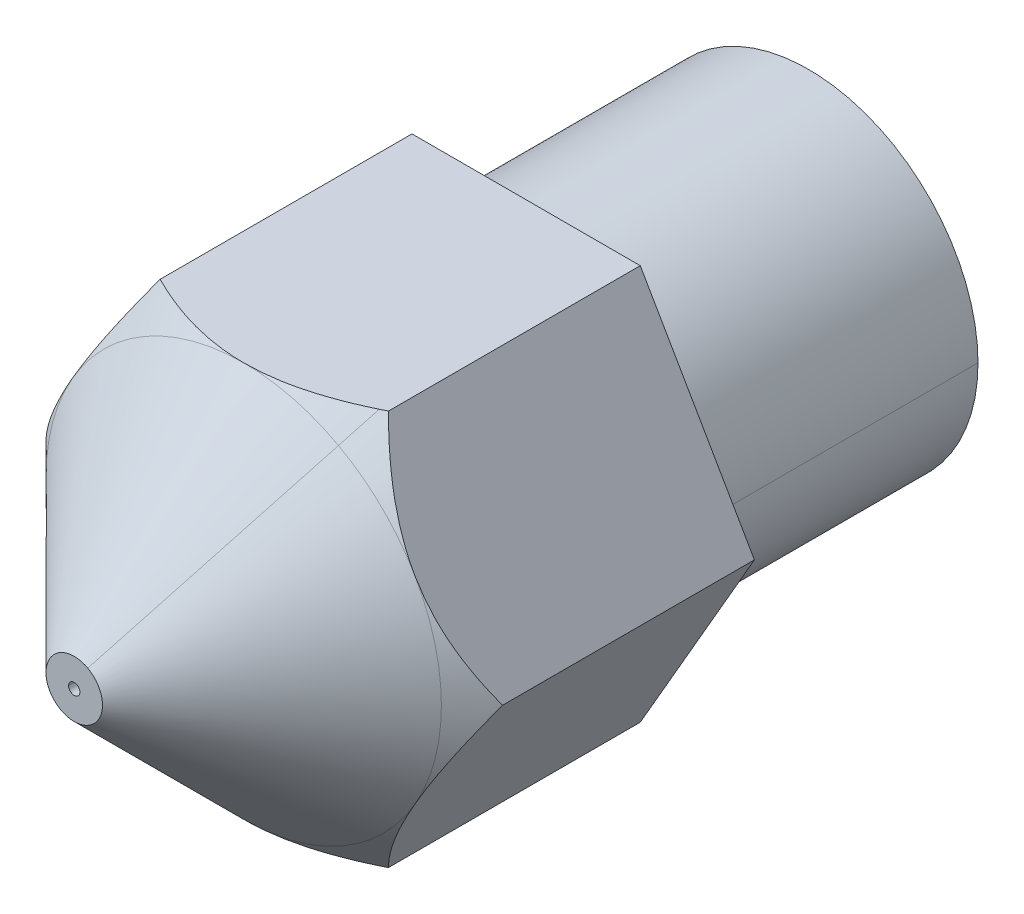
ISO-10303-21;
HEADER;
FILE_DESCRIPTION(('STEP AP214'),'2;1');
FILE_NAME('part.step','',(''),(''),'','','');
FILE_SCHEMA(('AUTOMOTIVE_DESIGN { 1 0 10303 214 1 1 1 1 }'));
ENDSEC;
DATA;
#1=APPLICATION_CONTEXT('core data for automotive mechanical design processes');
#2=APPLICATION_PROTOCOL_DEFINITION('international standard','automotive_design',2000,#1);
#3=PRODUCT_CONTEXT('',#1,'mechanical');
#4=PRODUCT('Part','Part','',(#3));
#5=PRODUCT_RELATED_PRODUCT_CATEGORY('part','',(#4));
#6=PRODUCT_DEFINITION_FORMATION('','',#4);
#7=PRODUCT_DEFINITION_CONTEXT('part definition',#1,'design');
#8=PRODUCT_DEFINITION('design','',#6,#7);
#9=PRODUCT_DEFINITION_SHAPE('','',#8);
#10=(LENGTH_UNIT() NAMED_UNIT(*) SI_UNIT(.MILLI.,.METRE.));
#11=(NAMED_UNIT(*) PLANE_ANGLE_UNIT() SI_UNIT($,.RADIAN.));
#12=(NAMED_UNIT(*) SI_UNIT($,.STERADIAN.) SOLID_ANGLE_UNIT());
#13=UNCERTAINTY_MEASURE_WITH_UNIT(LENGTH_MEASURE(1.E-05),#10,'distance_accuracy_value','');
#14=(GEOMETRIC_REPRESENTATION_CONTEXT(3) GLOBAL_UNCERTAINTY_ASSIGNED_CONTEXT((#13)) GLOBAL_UNIT_ASSIGNED_CONTEXT((#10,
#11,#12)) REPRESENTATION_CONTEXT('',''));
#15=CARTESIAN_POINT('',(0.,0.,0.));
#16=DIRECTION('',(0.,0.,1.));
#17=DIRECTION('',(1.,0.,0.));
#18=AXIS2_PLACEMENT_3D('',#15,#16,#17);
#19=CARTESIAN_POINT('',(0.,0.,8.));
#20=DIRECTION('',(0.,0.,1.));
#21=DIRECTION('',(1.,0.,0.));
#22=AXIS2_PLACEMENT_3D('',#19,#20,#21);
#23=PLANE('',#22);
#24=CARTESIAN_POINT('',(0.,0.,8.));
#25=DIRECTION('',(0.,0.,1.));
#26=DIRECTION('',(1.,0.,0.));
#27=AXIS2_PLACEMENT_3D('',#24,#25,#26);
#28=CIRCLE('',#27,0.1);
#29=CARTESIAN_POINT('',(-0.1,0.,8.));
#30=VERTEX_POINT('',#29);
#31=CARTESIAN_POINT('',(0.1,0.,8.));
#32=VERTEX_POINT('',#31);
#33=EDGE_CURVE('E272',#30,#32,#28,.F.);
#34=ORIENTED_EDGE('',*,*,#33,.T.);
#35=CARTESIAN_POINT('',(0.,0.,8.));
#36=DIRECTION('',(0.,0.,1.));
#37=DIRECTION('',(1.,0.,0.));
#38=AXIS2_PLACEMENT_3D('',#35,#36,#37);
#39=CIRCLE('',#38,0.1);
#40=EDGE_CURVE('E874',#32,#30,#39,.F.);
#41=ORIENTED_EDGE('',*,*,#40,.T.);
#42=EDGE_LOOP('',(#34,#41));
#43=FACE_BOUND('',#42,.T.);
#44=CARTESIAN_POINT('',(0.,0.,7.99999999998136));
#45=DIRECTION('',(0.,0.,-1.));
#46=DIRECTION('',(-1.,0.,0.));
#47=AXIS2_PLACEMENT_3D('',#44,#45,#46);
#48=CIRCLE('',#47,0.500000000009776);
#49=CARTESIAN_POINT('',(-0.239712769300711,-0.43879128094552,7.99999999998136));
#50=VERTEX_POINT('',#49);
#51=CARTESIAN_POINT('',(0.239712769306789,0.438791280953767,7.99999999998136));
#52=VERTEX_POINT('',#51);
#53=EDGE_CURVE('E19',#50,#52,#48,.T.);
#54=ORIENTED_EDGE('',*,*,#53,.F.);
#55=CARTESIAN_POINT('',(0.,0.,7.99999999998136));
#56=DIRECTION('',(0.,0.,-1.));
#57=DIRECTION('',(-1.,0.,0.));
#58=AXIS2_PLACEMENT_3D('',#55,#56,#57);
#59=CIRCLE('',#58,0.500000000009776);
#60=EDGE_CURVE('E116',#52,#50,#59,.T.);
#61=ORIENTED_EDGE('',*,*,#60,.F.);
#62=EDGE_LOOP('',(#54,#61));
#63=FACE_BOUND('',#62,.T.);
#64=ADVANCED_FACE('F16',(#43,#63),#23,.T.);
#65=CARTESIAN_POINT('',(0.,0.,4.99999999988177));
#66=DIRECTION('',(0.,0.,-1.));
#67=DIRECTION('',(-1.,0.,0.));
#68=AXIS2_PLACEMENT_3D('',#65,#66,#67);
#69=CONICAL_SURFACE('',#68,3.50000000010789,0.785398163397202);
#70=ORIENTED_EDGE('',*,*,#53,.T.);
#71=CARTESIAN_POINT('',(1.67798938512427,3.07153896664613,4.99999999999545));
#72=CARTESIAN_POINT('',(1.61806119280186,2.96184114639585,5.12499999997491));
#73=CARTESIAN_POINT('',(1.55813300047966,2.85214332615662,5.24999999996417));
#74=CARTESIAN_POINT('',(1.43827661583465,2.63274768567851,5.49999999996163));
#75=CARTESIAN_POINT('',(1.37834842351184,2.52304986543962,5.62499999996984));
#76=CARTESIAN_POINT('',(1.25849203887364,2.30365422495704,5.8749999999856));
#77=CARTESIAN_POINT('',(1.19856384655825,2.19395640471335,5.99999999999315));
#78=CARTESIAN_POINT('',(1.07870746189761,1.97456076425215,6.24999999998587));
#79=CARTESIAN_POINT('',(1.01877926955236,1.86486294403462,6.37499999997104));
#80=CARTESIAN_POINT('',(0.898922884891036,1.64546730357457,6.62499999996445));
#81=CARTESIAN_POINT('',(0.838994692574969,1.53576948333204,6.74999999997269));
#82=CARTESIAN_POINT('',(0.719138307931427,1.31637384285002,6.99999999998638));
#83=CARTESIAN_POINT('',(0.659210115603953,1.20667602261054,7.12499999999183));
#84=CARTESIAN_POINT('',(0.53935373095432,0.987280382132798,7.37500000000635));
#85=CARTESIAN_POINT('',(0.479425538632161,0.87758256189455,7.50000000001544));
#86=CARTESIAN_POINT('',(0.359569153977755,0.658186921418388,7.75000000001465));
#87=CARTESIAN_POINT('',(0.299640961645507,0.548489101180475,7.87500000000478));
#88=CARTESIAN_POINT('',(0.23971276929706,0.438791280935958,7.99999999998136));
#89=B_SPLINE_CURVE_WITH_KNOTS('',3,(#71,#72,#73,#74,#75,#76,#77,#78,#79,#80,#81,#82,#83,#84,#85,
#86,#87,#88),.UNSPECIFIED.,.F.,.F.,(4,2,2,2,2,2,2,2,4),(0.,0.530330085869191,1.06066017177858,
1.59099025768796,2.12132034353152,2.6516504294409,3.18198051535029,3.71231060125967,
4.2426406871385),.UNSPECIFIED.);
#90=CARTESIAN_POINT('',(1.67798938507802,3.0715389665706,4.99999999999545));
#91=VERTEX_POINT('',#90);
#92=EDGE_CURVE('E109',#91,#52,#89,.T.);
#93=ORIENTED_EDGE('',*,*,#92,.F.);
#94=CARTESIAN_POINT('',(0.,0.,4.99999999993861));
#95=DIRECTION('',(0.,0.,-1.));
#96=DIRECTION('',(-0.479425538613767,-0.877582561885148,0.));
#97=AXIS2_PLACEMENT_3D('',#94,#95,#96);
#98=CIRCLE('',#97,3.49999999993098);
#99=CARTESIAN_POINT('',(0.,3.5,4.99999999997553));
#100=VERTEX_POINT('',#99);
#101=EDGE_CURVE('E404',#100,#91,#98,.T.);
#102=ORIENTED_EDGE('',*,*,#101,.F.);
#103=CARTESIAN_POINT('',(0.,0.,5.0000000000523));
#104=DIRECTION('',(0.,0.,-1.));
#105=DIRECTION('',(-0.479425538606934,-0.877582561888881,0.));
#106=AXIS2_PLACEMENT_3D('',#103,#104,#105);
#107=CIRCLE('',#106,3.49999999998087);
#108=CARTESIAN_POINT('',(-3.03108891323643,1.7499999999939,4.99999999999545));
#109=VERTEX_POINT('',#108);
#110=EDGE_CURVE('E387',#109,#100,#107,.T.);
#111=ORIENTED_EDGE('',*,*,#110,.F.);
#112=CARTESIAN_POINT('',(0.,0.,4.99999999993861));
#113=DIRECTION('',(0.,0.,-1.));
#114=DIRECTION('',(-0.479425538606934,-0.877582561888881,0.));
#115=AXIS2_PLACEMENT_3D('',#112,#113,#114);
#116=CIRCLE('',#115,3.49999999998087);
#117=CARTESIAN_POINT('',(-3.03108891323841,-1.74999999999504,4.99999999996703));
#118=VERTEX_POINT('',#117);
#119=EDGE_CURVE('E374',#118,#109,#116,.T.);
#120=ORIENTED_EDGE('',*,*,#119,.F.);
#121=CARTESIAN_POINT('',(0.,0.,4.99999999999545));
#122=DIRECTION('',(0.,0.,-1.));
#123=DIRECTION('',(-0.47942553860068,-0.877582561892297,0.));
#124=AXIS2_PLACEMENT_3D('',#121,#122,#123);
#125=CIRCLE('',#124,3.49999999996724);
#126=CARTESIAN_POINT('',(-1.67798938510799,-3.07153896659429,4.99999999996703));
#127=VERTEX_POINT('',#126);
#128=EDGE_CURVE('E388',#127,#118,#125,.T.);
#129=ORIENTED_EDGE('',*,*,#128,.F.);
#130=DIRECTION('',(0.339005049420893,0.620544580563467,0.707106781186864));
#131=VECTOR('',#130,1.);
#132=CARTESIAN_POINT('',(-239237.418880361,-437921.157834679,-499000.));
#133=LINE('',#132,#131);
#134=EDGE_CURVE('E113',#50,#127,#133,.F.);
#135=ORIENTED_EDGE('',*,*,#134,.F.);
#136=EDGE_LOOP('',(#70,#93,#102,#111,#120,#129,#135));
#137=FACE_BOUND('',#136,.T.);
#138=ADVANCED_FACE('F106',(#137),#69,.T.);
#139=CARTESIAN_POINT('',(0.,0.,4.99999999988177));
#140=DIRECTION('',(0.,0.,-1.));
#141=DIRECTION('',(-1.,0.,0.));
#142=AXIS2_PLACEMENT_3D('',#139,#140,#141);
#143=CONICAL_SURFACE('',#142,3.50000000010789,0.785398163397202);
#144=ORIENTED_EDGE('',*,*,#60,.T.);
#145=ORIENTED_EDGE('',*,*,#134,.T.);
#146=CARTESIAN_POINT('',(0.,0.,4.99999999993861));
#147=DIRECTION('',(0.,0.,-1.));
#148=DIRECTION('',(-0.479425538613767,-0.877582561885148,0.));
#149=AXIS2_PLACEMENT_3D('',#146,#147,#148);
#150=CIRCLE('',#149,3.49999999993098);
#151=CARTESIAN_POINT('',(0.,-3.5,4.99999999997553));
#152=VERTEX_POINT('',#151);
#153=EDGE_CURVE('E369',#152,#127,#150,.T.);
#154=ORIENTED_EDGE('',*,*,#153,.F.);
#155=CARTESIAN_POINT('',(0.,0.,5.0000000000523));
#156=DIRECTION('',(0.,0.,-1.));
#157=DIRECTION('',(-0.479425538606934,-0.877582561888881,0.));
#158=AXIS2_PLACEMENT_3D('',#155,#156,#157);
#159=CIRCLE('',#158,3.49999999998087);
#160=CARTESIAN_POINT('',(3.03108891323643,-1.74999999999389,4.99999999999545));
#161=VERTEX_POINT('',#160);
#162=EDGE_CURVE('E392',#161,#152,#159,.T.);
#163=ORIENTED_EDGE('',*,*,#162,.F.);
#164=CARTESIAN_POINT('',(0.,0.,4.99999999993861));
#165=DIRECTION('',(0.,0.,-1.));
#166=DIRECTION('',(-0.479425538606934,-0.877582561888881,0.));
#167=AXIS2_PLACEMENT_3D('',#164,#165,#166);
#168=CIRCLE('',#167,3.49999999998087);
#169=CARTESIAN_POINT('',(3.03108891323841,1.74999999999504,4.99999999996703));
#170=VERTEX_POINT('',#169);
#171=EDGE_CURVE('E435',#170,#161,#168,.T.);
#172=ORIENTED_EDGE('',*,*,#171,.F.);
#173=CARTESIAN_POINT('',(0.,0.,4.99999999999545));
#174=DIRECTION('',(0.,0.,-1.));
#175=DIRECTION('',(-0.47942553860068,-0.877582561892297,0.));
#176=AXIS2_PLACEMENT_3D('',#173,#174,#175);
#177=CIRCLE('',#176,3.49999999996724);
#178=EDGE_CURVE('E122',#91,#170,#177,.T.);
#179=ORIENTED_EDGE('',*,*,#178,.F.);
#180=ORIENTED_EDGE('',*,*,#92,.T.);
#181=EDGE_LOOP('',(#144,#145,#154,#163,#172,#179,#180));
#182=FACE_BOUND('',#181,.T.);
#183=ADVANCED_FACE('F120',(#182),#143,.T.);
#184=CARTESIAN_POINT('',(0.,0.,1.));
#185=DIRECTION('',(0.,0.,1.));
#186=DIRECTION('',(1.,0.,0.));
#187=AXIS2_PLACEMENT_3D('',#184,#185,#186);
#188=CYLINDRICAL_SURFACE('',#187,0.1);
#189=DIRECTION('',(0.,0.,1.));
#190=VECTOR('',#189,1.);
#191=CARTESIAN_POINT('',(-0.1,0.,1.));
#192=LINE('',#191,#190);
#193=CARTESIAN_POINT('',(-0.1,0.,1.99999999998817));
#194=VERTEX_POINT('',#193);
#195=EDGE_CURVE('E428',#194,#30,#192,.T.);
#196=ORIENTED_EDGE('',*,*,#195,.T.);
#197=ORIENTED_EDGE('',*,*,#40,.F.);
#198=DIRECTION('',(0.,0.,1.));
#199=VECTOR('',#198,1.);
#200=CARTESIAN_POINT('',(0.1,0.,1.));
#201=LINE('',#200,#199);
#202=CARTESIAN_POINT('',(0.100000000007935,0.,1.99999999998817));
#203=VERTEX_POINT('',#202);
#204=EDGE_CURVE('E411',#32,#203,#201,.F.);
#205=ORIENTED_EDGE('',*,*,#204,.T.);
#206=CARTESIAN_POINT('',(0.,0.,1.99999999995271));
#207=DIRECTION('',(0.,0.,-1.));
#208=DIRECTION('',(1.,0.,0.));
#209=AXIS2_PLACEMENT_3D('',#206,#207,#208);
#210=CIRCLE('',#209,0.100000000031741);
#211=EDGE_CURVE('E433',#203,#194,#210,.T.);
#212=ORIENTED_EDGE('',*,*,#211,.T.);
#213=EDGE_LOOP('',(#196,#197,#205,#212));
#214=FACE_BOUND('',#213,.T.);
#215=ADVANCED_FACE('F146',(#214),#188,.F.);
#216=CARTESIAN_POINT('',(0.,0.,1.));
#217=DIRECTION('',(0.,0.,1.));
#218=DIRECTION('',(1.,0.,0.));
#219=AXIS2_PLACEMENT_3D('',#216,#217,#218);
#220=CYLINDRICAL_SURFACE('',#219,0.1);
#221=ORIENTED_EDGE('',*,*,#204,.F.);
#222=ORIENTED_EDGE('',*,*,#33,.F.);
#223=ORIENTED_EDGE('',*,*,#195,.F.);
#224=CARTESIAN_POINT('',(0.,0.,1.99999999995271));
#225=DIRECTION('',(0.,0.,-1.));
#226=DIRECTION('',(1.,0.,0.));
#227=AXIS2_PLACEMENT_3D('',#224,#225,#226);
#228=CIRCLE('',#227,0.100000000031741);
#229=EDGE_CURVE('E271',#194,#203,#228,.T.);
#230=ORIENTED_EDGE('',*,*,#229,.T.);
#231=EDGE_LOOP('',(#221,#222,#223,#230));
#232=FACE_BOUND('',#231,.T.);
#233=ADVANCED_FACE('F779',(#232),#220,.F.);
#234=CARTESIAN_POINT('',(0.,0.,4.50884186636813));
#235=DIRECTION('',(0.,0.,-1.));
#236=DIRECTION('',(-1.,0.,0.));
#237=AXIS2_PLACEMENT_3D('',#234,#235,#236);
#238=CONICAL_SURFACE('',#237,3.99115813356201,0.785398163429384);
#239=DIRECTION('',(-0.339005049422463,-0.62054458056261,0.707106781186865));
#240=VECTOR('',#239,1.);
#241=CARTESIAN_POINT('',(239237.418881469,437921.157834074,-499000.));
#242=LINE('',#241,#240);
#243=CARTESIAN_POINT('',(1.91205871442823,3.49999999998704,4.51177125429312));
#244=VERTEX_POINT('',#243);
#245=EDGE_CURVE('E405',#244,#91,#242,.T.);
#246=ORIENTED_EDGE('',*,*,#245,.F.);
#247=CARTESIAN_POINT('',(0.,3.50000000001517,4.99999999990506));
#248=CARTESIAN_POINT('',(0.0537438893080083,3.50000000000559,5.00000431740818));
#249=CARTESIAN_POINT('',(0.107479833417426,3.50000000000153,4.99876149660475));
#250=CARTESIAN_POINT('',(0.214830405244049,3.49999999999847,4.99382215420302));
#251=CARTESIAN_POINT('',(0.268445051156603,3.49999999999947,4.99012602901145));
#252=CARTESIAN_POINT('',(0.428769144089407,3.50000000000107,4.97543679133601));
#253=CARTESIAN_POINT('',(0.535166225951488,3.50000000000028,4.96084250495271));
#254=CARTESIAN_POINT('',(0.744779456656462,3.49999999999972,4.92310106009015));
#255=CARTESIAN_POINT('',(0.848019372597776,3.49999999999992,4.90008257601016));
#256=CARTESIAN_POINT('',(1.05252816620887,3.50000000000008,4.84649885454744));
#257=CARTESIAN_POINT('',(1.15379650469752,3.50000000000002,4.81593158317247));
#258=CARTESIAN_POINT('',(1.36592879184903,3.49999999999998,4.74438489932662));
#259=CARTESIAN_POINT('',(1.47652073776792,3.5,4.70260377302413));
#260=CARTESIAN_POINT('',(1.64079899803225,3.5,4.63480851587852));
#261=CARTESIAN_POINT('',(1.69551871253213,3.5,4.61124519519848));
#262=CARTESIAN_POINT('',(1.80428632574313,3.5,4.56260407099588));
#263=CARTESIAN_POINT('',(1.85833417612897,3.5,4.53752615928442));
#264=CARTESIAN_POINT('',(1.91205871440441,3.5,4.51177125431746));
#265=B_SPLINE_CURVE_WITH_KNOTS('',3,(#247,#248,#249,#250,#251,#252,#253,#254,#255,#256,#257,
#258,#259,#260,#261,#262,#263,#264),.UNSPECIFIED.,.F.,.F.,(4,2,2,2,2,2,2,2,4),(0.,
0.161202115360536,0.322378189903186,0.644110241448437,0.961120228910556,1.2782157268909,
1.63260008767214,1.81131453852701,1.99004177028349),.UNSPECIFIED.);
#266=EDGE_CURVE('E237',#100,#244,#265,.T.);
#267=ORIENTED_EDGE('',*,*,#266,.F.);
#268=ORIENTED_EDGE('',*,*,#101,.T.);
#269=EDGE_LOOP('',(#246,#267,#268));
#270=FACE_BOUND('',#269,.T.);
#271=ADVANCED_FACE('F278',(#270),#238,.T.);
#272=CARTESIAN_POINT('',(0.,0.,4.45529935950617));
#273=DIRECTION('',(0.,0.,-1.));
#274=DIRECTION('',(-1.,0.,0.));
#275=AXIS2_PLACEMENT_3D('',#272,#273,#274);
#276=CONICAL_SURFACE('',#275,4.04470064052161,0.785398163398872);
#277=CARTESIAN_POINT('',(-2.02072594217201,3.49999999999595,4.45854811569402));
#278=CARTESIAN_POINT('',(-1.88093245127298,3.49999999999854,4.52837901785558));
#279=CARTESIAN_POINT('',(-1.73877627195135,3.49999999999961,4.59408444819449));
#280=CARTESIAN_POINT('',(-1.44879621005957,3.50000000000039,4.71432170140717));
#281=CARTESIAN_POINT('',(-1.30094201392687,3.5000000000001,4.76877974906485));
#282=CARTESIAN_POINT('',(-1.00476955774459,3.4999999999999,4.86126198890604));
#283=CARTESIAN_POINT('',(-0.856589672504894,3.49999999999997,4.89971780199748));
#284=CARTESIAN_POINT('',(-0.557051165471067,3.50000000000003,4.95896722037616));
#285=CARTESIAN_POINT('',(-0.40570372153932,3.5,4.97981478233541));
#286=CARTESIAN_POINT('',(-0.211604713552417,3.5,4.99386421140873));
#287=CARTESIAN_POINT('',(-0.169418902062033,3.5,4.9961570401718));
#288=CARTESIAN_POINT('',(-0.0848248871663844,3.5,4.9992273432721));
#289=CARTESIAN_POINT('',(-0.0424164647431157,3.5,4.99999877930066));
#290=CARTESIAN_POINT('',(0.,3.5,5.00000000002624));
#291=B_SPLINE_CURVE_WITH_KNOTS('',3,(#277,#278,#279,#280,#281,#282,#283,#284,#285,#286,#287,
#288,#289,#290),.UNSPECIFIED.,.F.,.F.,(4,2,2,2,2,2,4),(0.,0.469138863521484,0.941263532851166,
1.39966676498238,1.85666017024131,1.98338469941467,2.11061118580354),.UNSPECIFIED.);
#292=CARTESIAN_POINT('',(-2.02072594216645,3.5,4.45854811569902));
#293=VERTEX_POINT('',#292);
#294=EDGE_CURVE('E262',#293,#100,#291,.T.);
#295=ORIENTED_EDGE('',*,*,#294,.F.);
#296=CARTESIAN_POINT('',(-3.03108891324427,1.74999999999669,5.00000000002899));
#297=CARTESIAN_POINT('',(-3.00421079533778,1.79655426582253,5.00000430482122));
#298=CARTESIAN_POINT('',(-2.97733669567062,1.8431015718537,4.99876092167403));
#299=CARTESIAN_POINT('',(-2.92364907977518,1.93609125032179,4.99381933160931));
#300=CARTESIAN_POINT('',(-2.89683555468245,1.98253363811239,4.99012151084873));
#301=CARTESIAN_POINT('',(-2.81665771078186,2.12140573738948,4.97542599034025));
#302=CARTESIAN_POINT('',(-2.76344953244113,2.21356500565377,4.96082591165504));
#303=CARTESIAN_POINT('',(-2.65864660022774,2.39508900902946,4.92307849947422));
#304=CARTESIAN_POINT('',(-2.60703961577896,2.48447492812012,4.90006339492437));
#305=CARTESIAN_POINT('',(-2.504804852753,2.66155073198076,4.84648680811154));
#306=CARTESIAN_POINT('',(-2.45417738621706,2.74924007627945,4.81592296240941));
#307=CARTESIAN_POINT('',(-2.37137915304133,2.89265082291667,4.76007104486398));
#308=CARTESIAN_POINT('',(-2.33889170638276,2.94892073113749,4.73662459523922));
#309=CARTESIAN_POINT('',(-2.27439263499997,3.06063639981342,4.68728344897216));
#310=CARTESIAN_POINT('',(-2.24238091155688,3.11608233125468,4.66138926871358));
#311=CARTESIAN_POINT('',(-2.17849278970334,3.2267398043051,4.60714796474922));
#312=CARTESIAN_POINT('',(-2.14662121328686,3.28194299397573,4.57877824566594));
#313=CARTESIAN_POINT('',(-2.08333556508252,3.39155695205553,4.52007399763608));
#314=CARTESIAN_POINT('',(-2.0519214629953,3.44596777294472,4.48973959954537));
#315=CARTESIAN_POINT('',(-2.02072594215368,3.50000000001095,4.45854811569592));
#316=B_SPLINE_CURVE_WITH_KNOTS('',3,(#296,#297,#298,#299,#300,#301,#302,#303,#304,#305,#306,
#307,#308,#309,#310,#311,#312,#313,#314,#315),.UNSPECIFIED.,.F.,.F.,(4,2,2,2,2,2,2,2,2,4),(0.,
0.161238963224039,0.32245256471502,0.644242625579463,0.961179512596089,1.27821575561131,
1.48539667251879,1.69253397878685,1.90181313169413,2.11107836003676),.UNSPECIFIED.);
#317=EDGE_CURVE('E284',#109,#293,#316,.T.);
#318=ORIENTED_EDGE('',*,*,#317,.F.);
#319=ORIENTED_EDGE('',*,*,#110,.T.);
#320=EDGE_LOOP('',(#295,#318,#319));
#321=FACE_BOUND('',#320,.T.);
#322=ADVANCED_FACE('F274',(#321),#276,.T.);
#323=CARTESIAN_POINT('',(0.,0.,4.45529935939248));
#324=DIRECTION('',(0.,0.,-1.));
#325=DIRECTION('',(-1.,0.,0.));
#326=AXIS2_PLACEMENT_3D('',#323,#324,#325);
#327=CONICAL_SURFACE('',#326,4.04470064053524,0.785398163347004);
#328=CARTESIAN_POINT('',(-4.04145188432244,2.47660141388499E-11,4.45854811562034));
#329=CARTESIAN_POINT('',(-3.9715551388731,0.121064714413331,4.52837901777724));
#330=CARTESIAN_POINT('',(-3.90047704921647,0.244175576998003,4.59408444811443));
#331=CARTESIAN_POINT('',(-3.75548701828248,0.495305677162509,4.71432170132728));
#332=CARTESIAN_POINT('',(-3.68155992022385,0.623351167057593,4.76877974898687));
#333=CARTESIAN_POINT('',(-3.53347369214704,0.879844037988781,4.86126198883297));
#334=CARTESIAN_POINT('',(-3.45938374953383,1.00817158292429,4.8997178019274));
#335=CARTESIAN_POINT('',(-3.30961449603023,1.26757953940378,4.95896722031412));
#336=CARTESIAN_POINT('',(-3.23394077407104,1.39865027063499,4.97981478227842));
#337=CARTESIAN_POINT('',(-3.13689127007353,1.56674494240797,4.99386421136096));
#338=CARTESIAN_POINT('',(-3.11579836431781,1.60327892685611,4.9961570401266));
#339=CARTESIAN_POINT('',(-3.0735013568488,1.67653949280053,4.99922734323037));
#340=CARTESIAN_POINT('',(-3.05229714562649,1.71326626397196,4.99999877925982));
#341=CARTESIAN_POINT('',(-3.03108891324427,1.74999999999669,4.99999999998543));
#342=B_SPLINE_CURVE_WITH_KNOTS('',3,(#328,#329,#330,#331,#332,#333,#334,#335,#336,#337,#338,
#339,#340,#341),.UNSPECIFIED.,.F.,.F.,(4,2,2,2,2,2,4),(0.,0.46913886348355,0.941263532775377,
1.39966676486923,1.85666017009083,1.98338469932758,2.11061118578039),.UNSPECIFIED.);
#343=CARTESIAN_POINT('',(-4.04145188432114,1.07700006891157E-11,4.45854811560691));
#344=VERTEX_POINT('',#343);
#345=EDGE_CURVE('E238',#344,#109,#342,.T.);
#346=ORIENTED_EDGE('',*,*,#345,.F.);
#347=CARTESIAN_POINT('',(-3.03108891324823,-1.74999999999898,4.99999999998085));
#348=CARTESIAN_POINT('',(-3.05796703115233,-1.70344573417729,5.00000430477299));
#349=CARTESIAN_POINT('',(-3.08484113081709,-1.65689842815026,4.9987609216258));
#350=CARTESIAN_POINT('',(-3.13852874670775,-1.56390874969046,4.99381933156128));
#351=CARTESIAN_POINT('',(-3.16534227179808,-1.517466361904,4.99012151080089));
#352=CARTESIAN_POINT('',(-3.24552011569151,-1.37859426263932,4.97542599029324));
#353=CARTESIAN_POINT('',(-3.29872829402748,-1.28643499438328,4.96082591160895));
#354=CARTESIAN_POINT('',(-3.40353122623138,-1.10491099102402,4.92307849943059));
#355=CARTESIAN_POINT('',(-3.45513821067544,-1.01552507194153,4.9000633948823));
#356=CARTESIAN_POINT('',(-3.557372973692,-0.838449268097193,4.84648680807308));
#357=CARTESIAN_POINT('',(-3.60800044022325,-0.750759923806605,4.81592296237302));
#358=CARTESIAN_POINT('',(-3.69079867339736,-0.607349177172183,4.7600710448272));
#359=CARTESIAN_POINT('',(-3.72328612005891,-0.551079268946232,4.73662459519937));
#360=CARTESIAN_POINT('',(-3.78778519144747,-0.439363600260295,4.68728344892545));
#361=CARTESIAN_POINT('',(-3.81979691489337,-0.383917668814182,4.66138926866307));
#362=CARTESIAN_POINT('',(-3.88368503675247,-0.273260195754112,4.60714796469039));
#363=CARTESIAN_POINT('',(-3.91555661317172,-0.218057006078691,4.57877824560257));
#364=CARTESIAN_POINT('',(-3.97884226138143,-0.108443047989608,4.52007399756313));
#365=CARTESIAN_POINT('',(-4.01025636347124,-0.054032227095914,4.48973959946737));
#366=CARTESIAN_POINT('',(-4.04145188431539,-2.53047652962617E-11,4.45854811561266));
#367=B_SPLINE_CURVE_WITH_KNOTS('',3,(#347,#348,#349,#350,#351,#352,#353,#354,#355,#356,#357,
#358,#359,#360,#361,#362,#363,#364,#365,#366),.UNSPECIFIED.,.F.,.F.,(4,2,2,2,2,2,2,2,2,4),(0.,
0.161238963209682,0.322452564686309,0.644242625522097,0.961179512510056,1.27821575549661,
1.48539667242393,1.69253397871185,1.90181313163979,2.11107836000302),.UNSPECIFIED.);
#368=EDGE_CURVE('E301',#118,#344,#367,.T.);
#369=ORIENTED_EDGE('',*,*,#368,.F.);
#370=ORIENTED_EDGE('',*,*,#119,.T.);
#371=EDGE_LOOP('',(#346,#369,#370));
#372=FACE_BOUND('',#371,.T.);
#373=ADVANCED_FACE('F277',(#372),#327,.T.);
#374=CARTESIAN_POINT('',(0.,0.,4.50884186636813));
#375=DIRECTION('',(0.,0.,-1.));
#376=DIRECTION('',(-1.,0.,0.));
#377=AXIS2_PLACEMENT_3D('',#374,#375,#376);
#378=CONICAL_SURFACE('',#377,3.99115813356201,0.785398163429384);
#379=DIRECTION('',(0.339005049420893,0.620544580563467,0.707106781186865));
#380=VECTOR('',#379,1.);
#381=CARTESIAN_POINT('',(-239237.418880361,-437921.157834679,-499000.));
#382=LINE('',#381,#380);
#383=CARTESIAN_POINT('',(-1.91205871442086,-3.49999999998704,4.51177125434669));
#384=VERTEX_POINT('',#383);
#385=EDGE_CURVE('E373',#384,#127,#382,.T.);
#386=ORIENTED_EDGE('',*,*,#385,.F.);
#387=CARTESIAN_POINT('',(0.,-3.50000000001517,4.99999999990505));
#388=CARTESIAN_POINT('',(-0.0537438893080099,-3.50000000000559,5.00000431740818));
#389=CARTESIAN_POINT('',(-0.107479833417429,-3.50000000000153,4.99876149660475));
#390=CARTESIAN_POINT('',(-0.214830405244056,-3.49999999999847,4.99382215420302));
#391=CARTESIAN_POINT('',(-0.268445051156612,-3.49999999999947,4.99012602901145));
#392=CARTESIAN_POINT('',(-0.42876914408942,-3.50000000000107,4.975436791336));
#393=CARTESIAN_POINT('',(-0.535166225951504,-3.50000000000028,4.9608425049527));
#394=CARTESIAN_POINT('',(-0.744779456656477,-3.49999999999972,4.92310106009014));
#395=CARTESIAN_POINT('',(-0.848019372597788,-3.49999999999992,4.90008257601016));
#396=CARTESIAN_POINT('',(-1.05252816620887,-3.50000000000008,4.84649885454743));
#397=CARTESIAN_POINT('',(-1.15379650469752,-3.50000000000002,4.81593158317246));
#398=CARTESIAN_POINT('',(-1.36592879185156,-3.49999999999998,4.74438489932577));
#399=CARTESIAN_POINT('',(-1.47652073777291,-3.5,4.70260377302224));
#400=CARTESIAN_POINT('',(-1.64079899804086,-3.5,4.63480851587487));
#401=CARTESIAN_POINT('',(-1.69551871254195,-3.5,4.61124519519421));
#402=CARTESIAN_POINT('',(-1.80428632575534,-3.5,4.5626040709903));
#403=CARTESIAN_POINT('',(-1.85833417614235,-3.5,4.53752615927815));
#404=CARTESIAN_POINT('',(-1.91205871441896,-3.5,4.51177125431048));
#405=B_SPLINE_CURVE_WITH_KNOTS('',3,(#387,#388,#389,#390,#391,#392,#393,#394,#395,#396,#397,
#398,#399,#400,#401,#402,#403,#404),.UNSPECIFIED.,.F.,.F.,(4,2,2,2,2,2,2,2,4),(0.,
0.161202115360542,0.322378189903197,0.644110241448456,0.961120228910566,1.2782157268909,
1.63260008768013,1.81131453853907,1.99004177029961),.UNSPECIFIED.);
#406=EDGE_CURVE('E326',#152,#384,#405,.T.);
#407=ORIENTED_EDGE('',*,*,#406,.F.);
#408=ORIENTED_EDGE('',*,*,#153,.T.);
#409=EDGE_LOOP('',(#386,#407,#408));
#410=FACE_BOUND('',#409,.T.);
#411=ADVANCED_FACE('F312',(#410),#378,.T.);
#412=CARTESIAN_POINT('',(0.,0.,4.45529935933564));
#413=DIRECTION('',(0.,0.,-1.));
#414=DIRECTION('',(-1.,0.,0.));
#415=AXIS2_PLACEMENT_3D('',#412,#413,#414);
#416=CONICAL_SURFACE('',#415,4.04470064058512,0.785398163347004);
#417=CARTESIAN_POINT('',(-2.02072595058493,-3.49999999813897,4.45854812199075));
#418=CARTESIAN_POINT('',(-2.0906226928052,-3.37893528118366,4.52837902204003));
#419=CARTESIAN_POINT('',(-2.16170078106733,-3.25582441766123,4.59408445133279));
#420=CARTESIAN_POINT('',(-2.30669081083892,-3.00469431704164,4.71432170341374));
#421=CARTESIAN_POINT('',(-2.38061790914049,-2.87664882763754,4.76877975098921));
#422=CARTESIAN_POINT('',(-2.52870413727504,-2.62015595724956,4.86126199044187));
#423=CARTESIAN_POINT('',(-2.60279407971722,-2.4918284123753,4.89971780322796));
#424=CARTESIAN_POINT('',(-2.75256333297575,-2.23242045615679,4.95896722108028));
#425=CARTESIAN_POINT('',(-2.82823705486046,-2.10134972512519,4.97981478281964));
#426=CARTESIAN_POINT('',(-2.9252865583692,-1.93325505421286,4.9938642115765));
#427=CARTESIAN_POINT('',(-2.94637946373802,-1.89672107043331,4.99615704025752));
#428=CARTESIAN_POINT('',(-2.98867647042746,-1.8234605058361,4.99922734324719));
#429=CARTESIAN_POINT('',(-3.00988068125706,-1.7867337353433,4.99999877924759));
#430=CARTESIAN_POINT('',(-3.03108891324823,-1.74999999999898,4.99999999997389));
#431=B_SPLINE_CURVE_WITH_KNOTS('',3,(#417,#418,#419,#420,#421,#422,#423,#424,#425,#426,#427,
#428,#429,#430),.UNSPECIFIED.,.F.,.F.,(4,2,2,2,2,2,4),(0.,0.469138862489868,0.94126353089019,
1.39966676231901,1.8566601668414,1.98338469375126,2.11061117785155),.UNSPECIFIED.);
#432=CARTESIAN_POINT('',(-2.02072594396673,-3.49999999687523,4.45854811739832));
#433=VERTEX_POINT('',#432);
#434=EDGE_CURVE('E293',#433,#118,#431,.T.);
#435=ORIENTED_EDGE('',*,*,#434,.F.);
#436=CARTESIAN_POINT('',(-1.91205871441853,-3.50000000000559,4.51177125431019));
#437=CARTESIAN_POINT('',(-1.93024351627504,-3.50000000000279,4.50305099460585));
#438=CARTESIAN_POINT('',(-1.94839151994639,-3.50000000000093,4.49425560297837));
#439=CARTESIAN_POINT('',(-1.98461392678681,-3.49999999999907,4.47651455790085));
#440=CARTESIAN_POINT('',(-2.00268832997268,-3.49999999999907,4.46756890448509));
#441=CARTESIAN_POINT('',(-2.02072593499017,-3.5,4.45854811918047));
#442=B_SPLINE_CURVE_WITH_KNOTS('',3,(#436,#437,#438,#439,#440,#441),.UNSPECIFIED.,.F.,.F.,(4,2,
4),(0.,0.0605010790005074,0.121002144198067),.UNSPECIFIED.);
#443=EDGE_CURVE('E317',#384,#433,#442,.T.);
#444=ORIENTED_EDGE('',*,*,#443,.F.);
#445=ORIENTED_EDGE('',*,*,#385,.T.);
#446=ORIENTED_EDGE('',*,*,#128,.T.);
#447=EDGE_LOOP('',(#435,#444,#445,#446));
#448=FACE_BOUND('',#447,.T.);
#449=ADVANCED_FACE('F309',(#448),#416,.T.);
#450=CARTESIAN_POINT('',(0.,0.,4.45529935950617));
#451=DIRECTION('',(0.,0.,-1.));
#452=DIRECTION('',(-1.,0.,0.));
#453=AXIS2_PLACEMENT_3D('',#450,#451,#452);
#454=CONICAL_SURFACE('',#453,4.04470064052161,0.785398163398872);
#455=CARTESIAN_POINT('',(2.02072594217201,-3.49999999999595,4.45854811569401));
#456=CARTESIAN_POINT('',(1.88093245127298,-3.49999999999854,4.52837901785557));
#457=CARTESIAN_POINT('',(1.73877627195135,-3.49999999999961,4.59408444819449));
#458=CARTESIAN_POINT('',(1.44879621005957,-3.50000000000039,4.71432170140717));
#459=CARTESIAN_POINT('',(1.30094201392687,-3.5000000000001,4.76877974906485));
#460=CARTESIAN_POINT('',(1.00476955774459,-3.4999999999999,4.86126198890604));
#461=CARTESIAN_POINT('',(0.856589672504893,-3.49999999999997,4.89971780199748));
#462=CARTESIAN_POINT('',(0.557051165471065,-3.50000000000003,4.95896722037616));
#463=CARTESIAN_POINT('',(0.405703721539319,-3.5,4.9798147823354));
#464=CARTESIAN_POINT('',(0.211604713552416,-3.5,4.99386421140873));
#465=CARTESIAN_POINT('',(0.169418902062032,-3.5,4.9961570401718));
#466=CARTESIAN_POINT('',(0.084824887166384,-3.5,4.9992273432721));
#467=CARTESIAN_POINT('',(0.0424164647431158,-3.5,4.99999877930065));
#468=CARTESIAN_POINT('',(0.,-3.5,5.00000000002623));
#469=B_SPLINE_CURVE_WITH_KNOTS('',3,(#455,#456,#457,#458,#459,#460,#461,#462,#463,#464,#465,
#466,#467,#468),.UNSPECIFIED.,.F.,.F.,(4,2,2,2,2,2,4),(0.,0.469138863521485,0.941263532851165,
1.39966676498238,1.85666017024131,1.98338469941467,2.11061118580354),.UNSPECIFIED.);
#470=CARTESIAN_POINT('',(2.02072594216645,-3.5,4.45854811569901));
#471=VERTEX_POINT('',#470);
#472=EDGE_CURVE('E342',#471,#152,#469,.T.);
#473=ORIENTED_EDGE('',*,*,#472,.F.);
#474=CARTESIAN_POINT('',(3.03108891324427,-1.74999999999669,5.00000000002898));
#475=CARTESIAN_POINT('',(3.00421079533778,-1.79655426582253,5.00000430482122));
#476=CARTESIAN_POINT('',(2.97733669567062,-1.8431015718537,4.99876092167403));
#477=CARTESIAN_POINT('',(2.92364907977518,-1.93609125032179,4.99381933160931));
#478=CARTESIAN_POINT('',(2.89683555468245,-1.98253363811239,4.99012151084873));
#479=CARTESIAN_POINT('',(2.81665771078186,-2.12140573738948,4.97542599034025));
#480=CARTESIAN_POINT('',(2.76344953244113,-2.21356500565377,4.96082591165504));
#481=CARTESIAN_POINT('',(2.65864660022774,-2.39508900902946,4.92307849947421));
#482=CARTESIAN_POINT('',(2.60703961577896,-2.48447492812012,4.90006339492437));
#483=CARTESIAN_POINT('',(2.504804852753,-2.66155073198076,4.84648680811153));
#484=CARTESIAN_POINT('',(2.45417738621706,-2.74924007627945,4.81592296240941));
#485=CARTESIAN_POINT('',(2.37137915304133,-2.89265082291667,4.76007104486397));
#486=CARTESIAN_POINT('',(2.33889170638276,-2.94892073113749,4.73662459523922));
#487=CARTESIAN_POINT('',(2.27439263499997,-3.06063639981342,4.68728344897216));
#488=CARTESIAN_POINT('',(2.24238091155688,-3.11608233125468,4.66138926871358));
#489=CARTESIAN_POINT('',(2.17849278970334,-3.2267398043051,4.60714796474922));
#490=CARTESIAN_POINT('',(2.14662121328686,-3.28194299397573,4.57877824566594));
#491=CARTESIAN_POINT('',(2.08333556508252,-3.39155695205553,4.52007399763607));
#492=CARTESIAN_POINT('',(2.0519214629953,-3.44596777294472,4.48973959954537));
#493=CARTESIAN_POINT('',(2.02072594215368,-3.50000000001095,4.45854811569591));
#494=B_SPLINE_CURVE_WITH_KNOTS('',3,(#474,#475,#476,#477,#478,#479,#480,#481,#482,#483,#484,
#485,#486,#487,#488,#489,#490,#491,#492,#493),.UNSPECIFIED.,.F.,.F.,(4,2,2,2,2,2,2,2,2,4),(0.,
0.161238963224039,0.32245256471502,0.644242625579463,0.961179512596089,1.27821575561131,
1.48539667251879,1.69253397878685,1.90181313169413,2.11107836003676),.UNSPECIFIED.);
#495=EDGE_CURVE('E208',#161,#471,#494,.T.);
#496=ORIENTED_EDGE('',*,*,#495,.F.);
#497=ORIENTED_EDGE('',*,*,#162,.T.);
#498=EDGE_LOOP('',(#473,#496,#497));
#499=FACE_BOUND('',#498,.T.);
#500=ADVANCED_FACE('F219',(#499),#454,.T.);
#501=CARTESIAN_POINT('',(0.,0.,4.45529935933564));
#502=DIRECTION('',(0.,0.,-1.));
#503=DIRECTION('',(-1.,0.,0.));
#504=AXIS2_PLACEMENT_3D('',#501,#502,#503);
#505=CONICAL_SURFACE('',#504,4.04470064058512,0.785398163347004);
#506=CARTESIAN_POINT('',(2.02072594218631,3.49999999998121,4.45854811561114));
#507=CARTESIAN_POINT('',(2.09062268762472,3.37893528558695,4.52837901776814));
#508=CARTESIAN_POINT('',(2.16170077727676,3.25582442300011,4.59408444810517));
#509=CARTESIAN_POINT('',(2.30669080820714,3.00469432283442,4.71432170131749));
#510=CARTESIAN_POINT('',(2.38061790626677,2.87664883294033,4.76877974897671));
#511=CARTESIAN_POINT('',(2.52870413434403,2.62015596201031,4.86126198882222));
#512=CARTESIAN_POINT('',(2.60279407695673,2.49182841707499,4.89971780191642));
#513=CARTESIAN_POINT('',(2.75256333045969,2.23242046059611,4.95896722030279));
#514=CARTESIAN_POINT('',(2.82823705241875,2.10134972936534,4.97981478226697));
#515=CARTESIAN_POINT('',(2.92528655641654,1.93325505759192,4.99386421134951));
#516=CARTESIAN_POINT('',(2.94637946217274,1.89672107314293,4.99615704011518));
#517=CARTESIAN_POINT('',(2.98867646964273,1.82346050719683,4.99922734321894));
#518=CARTESIAN_POINT('',(3.00988068086551,1.78673373602455,4.99999877924835));
#519=CARTESIAN_POINT('',(3.03108891324823,1.74999999999898,4.9999999999739));
#520=B_SPLINE_CURVE_WITH_KNOTS('',3,(#506,#507,#508,#509,#510,#511,#512,#513,#514,#515,#516,
#517,#518,#519),.UNSPECIFIED.,.F.,.F.,(4,2,2,2,2,2,4),(0.,0.469138863482211,0.941263532772627,
1.3996667648651,1.85666017008536,1.98338469932502,2.11061118578076),.UNSPECIFIED.);
#521=CARTESIAN_POINT('',(2.02072594215589,3.49999999998756,4.45854811560839));
#522=VERTEX_POINT('',#521);
#523=EDGE_CURVE('E198',#522,#170,#520,.T.);
#524=ORIENTED_EDGE('',*,*,#523,.F.);
#525=CARTESIAN_POINT('',(1.91205871440144,3.49999999998926,4.51177125430962));
#526=CARTESIAN_POINT('',(1.93024351746195,3.49999999999463,4.50305099403209));
#527=CARTESIAN_POINT('',(1.94839152233189,3.49999999999821,4.49425560182047));
#528=CARTESIAN_POINT('',(1.98461393155869,3.50000000000179,4.4765145555528));
#529=CARTESIAN_POINT('',(2.00268833593233,3.50000000000179,4.46756890153104));
#530=CARTESIAN_POINT('',(2.0207259421322,3.5,4.45854811560946));
#531=B_SPLINE_CURVE_WITH_KNOTS('',3,(#525,#526,#527,#528,#529,#530),.UNSPECIFIED.,.F.,.F.,(4,2,
4),(0.,0.0605010830005739,0.121002152198163),.UNSPECIFIED.);
#532=EDGE_CURVE('E227',#244,#522,#531,.T.);
#533=ORIENTED_EDGE('',*,*,#532,.F.);
#534=ORIENTED_EDGE('',*,*,#245,.T.);
#535=ORIENTED_EDGE('',*,*,#178,.T.);
#536=EDGE_LOOP('',(#524,#533,#534,#535));
#537=FACE_BOUND('',#536,.T.);
#538=ADVANCED_FACE('F215',(#537),#505,.T.);
#539=CARTESIAN_POINT('',(0.,0.,4.45529935939248));
#540=DIRECTION('',(0.,0.,-1.));
#541=DIRECTION('',(-1.,0.,0.));
#542=AXIS2_PLACEMENT_3D('',#539,#540,#541);
#543=CONICAL_SURFACE('',#542,4.04470064053524,0.785398163347004);
#544=CARTESIAN_POINT('',(4.04145188432248,-2.44506186687358E-11,4.45854811562013));
#545=CARTESIAN_POINT('',(3.97155513887321,-0.121064714413053,4.52837901777707));
#546=CARTESIAN_POINT('',(3.90047704921661,-0.244175576997749,4.59408444811429));
#547=CARTESIAN_POINT('',(3.75548701828262,-0.49530567716229,4.71432170132719));
#548=CARTESIAN_POINT('',(3.68155992022398,-0.623351167057386,4.76877974898679));
#549=CARTESIAN_POINT('',(3.53347369214715,-0.879844037988601,4.86126198883291));
#550=CARTESIAN_POINT('',(3.45938374953392,-1.00817158292412,4.89971780192735));
#551=CARTESIAN_POINT('',(3.30961449603031,-1.26757953940364,4.9589672203141));
#552=CARTESIAN_POINT('',(3.23394077407111,-1.39865027063486,4.97981478227841));
#553=CARTESIAN_POINT('',(3.13689127007358,-1.56674494240788,4.99386421136095));
#554=CARTESIAN_POINT('',(3.11579836431786,-1.60327892685604,4.99615704012659));
#555=CARTESIAN_POINT('',(3.07350135684882,-1.6765394928005,4.99922734323036));
#556=CARTESIAN_POINT('',(3.0522971456265,-1.71326626397194,4.99999877925981));
#557=CARTESIAN_POINT('',(3.03108891324427,-1.74999999999669,4.99999999998543));
#558=B_SPLINE_CURVE_WITH_KNOTS('',3,(#544,#545,#546,#547,#548,#549,#550,#551,#552,#553,#554,
#555,#556,#557),.UNSPECIFIED.,.F.,.F.,(4,2,2,2,2,2,4),(0.,0.469138863483613,0.941263532775501,
1.3996667648694,1.85666017009106,1.98338469932787,2.11061118578075),.UNSPECIFIED.);
#559=CARTESIAN_POINT('',(4.04145188432122,-1.06263662901448E-11,4.45854811560683));
#560=VERTEX_POINT('',#559);
#561=EDGE_CURVE('E327',#560,#161,#558,.T.);
#562=ORIENTED_EDGE('',*,*,#561,.F.);
#563=CARTESIAN_POINT('',(3.03108891324823,1.74999999999898,4.99999999998085));
#564=CARTESIAN_POINT('',(3.05796703115233,1.70344573417728,5.000004304773));
#565=CARTESIAN_POINT('',(3.08484113081709,1.65689842815026,4.99876092162581));
#566=CARTESIAN_POINT('',(3.13852874670775,1.56390874969046,4.99381933156128));
#567=CARTESIAN_POINT('',(3.16534227179808,1.517466361904,4.99012151080089));
#568=CARTESIAN_POINT('',(3.24552011569151,1.37859426263932,4.97542599029324));
#569=CARTESIAN_POINT('',(3.29872829402748,1.28643499438328,4.96082591160895));
#570=CARTESIAN_POINT('',(3.40353122623138,1.10491099102402,4.92307849943059));
#571=CARTESIAN_POINT('',(3.45513821067544,1.01552507194153,4.9000633948823));
#572=CARTESIAN_POINT('',(3.557372973692,0.838449268097193,4.84648680807308));
#573=CARTESIAN_POINT('',(3.60800044022325,0.750759923806605,4.81592296237302));
#574=CARTESIAN_POINT('',(3.69079867339735,0.607349177172207,4.76007104482721));
#575=CARTESIAN_POINT('',(3.72328612005888,0.55107926894628,4.73662459519939));
#576=CARTESIAN_POINT('',(3.78778519144741,0.439363600260389,4.68728344892549));
#577=CARTESIAN_POINT('',(3.8197969148933,0.383917668814299,4.66138926866313));
#578=CARTESIAN_POINT('',(3.88368503675238,0.273260195754275,4.60714796469047));
#579=CARTESIAN_POINT('',(3.91555661317161,0.218057006078877,4.57877824560267));
#580=CARTESIAN_POINT('',(3.97884226138129,0.108443047989838,4.52007399756325));
#581=CARTESIAN_POINT('',(4.0102563634711,0.0540322270961657,4.48973959946751));
#582=CARTESIAN_POINT('',(4.04145188431523,2.55785345410043E-11,4.45854811561282));
#583=B_SPLINE_CURVE_WITH_KNOTS('',3,(#563,#564,#565,#566,#567,#568,#569,#570,#571,#572,#573,
#574,#575,#576,#577,#578,#579,#580,#581,#582),.UNSPECIFIED.,.F.,.F.,(4,2,2,2,2,2,2,2,2,4),(0.,
0.161238963209682,0.322452564686309,0.644242625522096,0.961179512510056,1.27821575549661,
1.48539667242384,1.69253397871167,1.90181313163952,2.11107836000267),.UNSPECIFIED.);
#584=EDGE_CURVE('E190',#170,#560,#583,.T.);
#585=ORIENTED_EDGE('',*,*,#584,.F.);
#586=ORIENTED_EDGE('',*,*,#171,.T.);
#587=EDGE_LOOP('',(#562,#585,#586));
#588=FACE_BOUND('',#587,.T.);
#589=ADVANCED_FACE('F218',(#588),#543,.T.);
#590=CARTESIAN_POINT('',(0.,0.,-5.68430618547166E-11));
#591=DIRECTION('',(0.,0.,-1.));
#592=DIRECTION('',(0.,1.,0.));
#593=AXIS2_PLACEMENT_3D('',#590,#591,#592);
#594=CONICAL_SURFACE('',#593,2.10000000004129,0.785398163397449);
#595=ORIENTED_EDGE('',*,*,#211,.F.);
#596=ORIENTED_EDGE('',*,*,#229,.F.);
#597=EDGE_LOOP('',(#595,#596));
#598=FACE_BOUND('',#597,.T.);
#599=CARTESIAN_POINT('',(0.,0.,-4.70110061989715E-13));
#600=DIRECTION('',(0.,0.,-1.));
#601=DIRECTION('',(-1.,0.,0.));
#602=AXIS2_PLACEMENT_3D('',#599,#600,#601);
#603=CIRCLE('',#602,2.1);
#604=CARTESIAN_POINT('',(-2.1,0.,-3.13406707993143E-13));
#605=VERTEX_POINT('',#604);
#606=CARTESIAN_POINT('',(2.1,0.,-3.13406707993143E-13));
#607=VERTEX_POINT('',#606);
#608=EDGE_CURVE('E524',#605,#607,#603,.T.);
#609=ORIENTED_EDGE('',*,*,#608,.T.);
#610=CARTESIAN_POINT('',(0.,0.,0.));
#611=DIRECTION('',(0.,0.,-1.));
#612=DIRECTION('',(-1.,0.,0.));
#613=AXIS2_PLACEMENT_3D('',#610,#611,#612);
#614=CIRCLE('',#613,2.1);
#615=EDGE_CURVE('E520',#607,#605,#614,.T.);
#616=ORIENTED_EDGE('',*,*,#615,.T.);
#617=EDGE_LOOP('',(#609,#616));
#618=FACE_BOUND('',#617,.T.);
#619=ADVANCED_FACE('F256',(#598,#618),#594,.F.);
#620=CARTESIAN_POINT('',(2.02072594216,3.5,0.));
#621=DIRECTION('',(0.,1.,0.));
#622=DIRECTION('',(0.,0.,1.));
#623=AXIS2_PLACEMENT_3D('',#620,#621,#622);
#624=PLANE('',#623);
#625=ORIENTED_EDGE('',*,*,#266,.T.);
#626=ORIENTED_EDGE('',*,*,#532,.T.);
#627=DIRECTION('',(0.,0.,1.));
#628=VECTOR('',#627,1.);
#629=CARTESIAN_POINT('',(2.02072594216396,3.50000000000229,0.));
#630=LINE('',#629,#628);
#631=CARTESIAN_POINT('',(2.02072594216396,3.50000000000229,0.));
#632=VERTEX_POINT('',#631);
#633=EDGE_CURVE('E207',#632,#522,#630,.T.);
#634=ORIENTED_EDGE('',*,*,#633,.F.);
#635=DIRECTION('',(1.,0.,0.));
#636=VECTOR('',#635,1.);
#637=CARTESIAN_POINT('',(0.,3.5,0.));
#638=LINE('',#637,#636);
#639=CARTESIAN_POINT('',(-2.02072594216,3.5,0.));
#640=VERTEX_POINT('',#639);
#641=EDGE_CURVE('E398',#632,#640,#638,.F.);
#642=ORIENTED_EDGE('',*,*,#641,.T.);
#643=DIRECTION('',(0.,0.,1.));
#644=VECTOR('',#643,1.);
#645=CARTESIAN_POINT('',(-2.02072594216,3.5,0.));
#646=LINE('',#645,#644);
#647=EDGE_CURVE('E236',#293,#640,#646,.F.);
#648=ORIENTED_EDGE('',*,*,#647,.F.);
#649=ORIENTED_EDGE('',*,*,#294,.T.);
#650=EDGE_LOOP('',(#625,#626,#634,#642,#648,#649));
#651=FACE_BOUND('',#650,.T.);
#652=ADVANCED_FACE('F252',(#651),#624,.T.);
#653=CARTESIAN_POINT('',(-2.02072594216,3.5,0.));
#654=DIRECTION('',(-0.866025403784329,0.50000000000019,0.));
#655=DIRECTION('',(-0.50000000000019,-0.866025403784329,0.));
#656=AXIS2_PLACEMENT_3D('',#653,#654,#655);
#657=PLANE('',#656);
#658=ORIENTED_EDGE('',*,*,#345,.T.);
#659=ORIENTED_EDGE('',*,*,#317,.T.);
#660=ORIENTED_EDGE('',*,*,#647,.T.);
#661=DIRECTION('',(-0.500000000001171,-0.866025403783762,0.));
#662=VECTOR('',#661,1.);
#663=CARTESIAN_POINT('',(-2.02072594216,3.5,0.));
#664=LINE('',#663,#662);
#665=CARTESIAN_POINT('',(-4.04145188432951,-8.55522553048267E-13,0.));
#666=VERTEX_POINT('',#665);
#667=EDGE_CURVE('E382',#640,#666,#664,.T.);
#668=ORIENTED_EDGE('',*,*,#667,.T.);
#669=DIRECTION('',(0.,0.,1.));
#670=VECTOR('',#669,1.);
#671=CARTESIAN_POINT('',(-4.04145188433,0.,0.));
#672=LINE('',#671,#670);
#673=EDGE_CURVE('E292',#344,#666,#672,.F.);
#674=ORIENTED_EDGE('',*,*,#673,.F.);
#675=EDGE_LOOP('',(#658,#659,#660,#668,#674));
#676=FACE_BOUND('',#675,.T.);
#677=ADVANCED_FACE('F255',(#676),#657,.T.);
#678=CARTESIAN_POINT('',(-4.04145188433,0.,0.));
#679=DIRECTION('',(-0.866025403784329,-0.50000000000019,0.));
#680=DIRECTION('',(0.50000000000019,-0.866025403784329,0.));
#681=AXIS2_PLACEMENT_3D('',#678,#679,#680);
#682=PLANE('',#681);
#683=ORIENTED_EDGE('',*,*,#434,.T.);
#684=ORIENTED_EDGE('',*,*,#368,.T.);
#685=ORIENTED_EDGE('',*,*,#673,.T.);
#686=DIRECTION('',(0.500000000001171,-0.866025403783763,0.));
#687=VECTOR('',#686,1.);
#688=CARTESIAN_POINT('',(-4.04145188433,0.,0.));
#689=LINE('',#688,#687);
#690=CARTESIAN_POINT('',(-2.02072594216099,-3.5,0.));
#691=VERTEX_POINT('',#690);
#692=EDGE_CURVE('E377',#666,#691,#689,.T.);
#693=ORIENTED_EDGE('',*,*,#692,.T.);
#694=DIRECTION('',(0.,0.,-1.));
#695=VECTOR('',#694,1.);
#696=CARTESIAN_POINT('',(-2.02072594216,-3.5,0.));
#697=LINE('',#696,#695);
#698=EDGE_CURVE('E349',#433,#691,#697,.T.);
#699=ORIENTED_EDGE('',*,*,#698,.F.);
#700=EDGE_LOOP('',(#683,#684,#685,#693,#699));
#701=FACE_BOUND('',#700,.T.);
#702=ADVANCED_FACE('F307',(#701),#682,.T.);
#703=CARTESIAN_POINT('',(-2.02072594216,-3.5,0.));
#704=DIRECTION('',(0.,-1.,0.));
#705=DIRECTION('',(0.,0.,-1.));
#706=AXIS2_PLACEMENT_3D('',#703,#704,#705);
#707=PLANE('',#706);
#708=ORIENTED_EDGE('',*,*,#406,.T.);
#709=ORIENTED_EDGE('',*,*,#443,.T.);
#710=ORIENTED_EDGE('',*,*,#698,.T.);
#711=DIRECTION('',(1.,0.,0.));
#712=VECTOR('',#711,1.);
#713=CARTESIAN_POINT('',(0.,-3.5,0.));
#714=LINE('',#713,#712);
#715=CARTESIAN_POINT('',(2.02072594216,-3.5,0.));
#716=VERTEX_POINT('',#715);
#717=EDGE_CURVE('E381',#691,#716,#714,.T.);
#718=ORIENTED_EDGE('',*,*,#717,.T.);
#719=DIRECTION('',(0.,0.,1.));
#720=VECTOR('',#719,1.);
#721=CARTESIAN_POINT('',(2.02072594216,-3.5,0.));
#722=LINE('',#721,#720);
#723=EDGE_CURVE('E325',#471,#716,#722,.F.);
#724=ORIENTED_EDGE('',*,*,#723,.F.);
#725=ORIENTED_EDGE('',*,*,#472,.T.);
#726=EDGE_LOOP('',(#708,#709,#710,#718,#724,#725));
#727=FACE_BOUND('',#726,.T.);
#728=ADVANCED_FACE('F336',(#727),#707,.T.);
#729=CARTESIAN_POINT('',(2.02072594216,-3.5,0.));
#730=DIRECTION('',(0.866025403784329,-0.50000000000019,0.));
#731=DIRECTION('',(0.50000000000019,0.866025403784329,0.));
#732=AXIS2_PLACEMENT_3D('',#729,#730,#731);
#733=PLANE('',#732);
#734=ORIENTED_EDGE('',*,*,#561,.T.);
#735=ORIENTED_EDGE('',*,*,#495,.T.);
#736=ORIENTED_EDGE('',*,*,#723,.T.);
#737=DIRECTION('',(0.50000000000117,0.866025403783763,0.));
#738=VECTOR('',#737,1.);
#739=CARTESIAN_POINT('',(2.02072594216,-3.5,0.));
#740=LINE('',#739,#738);
#741=CARTESIAN_POINT('',(4.0414518843295,8.64064110119308E-13,0.));
#742=VERTEX_POINT('',#741);
#743=EDGE_CURVE('E463',#716,#742,#740,.T.);
#744=ORIENTED_EDGE('',*,*,#743,.T.);
#745=DIRECTION('',(0.,0.,1.));
#746=VECTOR('',#745,1.);
#747=CARTESIAN_POINT('',(4.04145188433,0.,0.));
#748=LINE('',#747,#746);
#749=EDGE_CURVE('E546',#560,#742,#748,.F.);
#750=ORIENTED_EDGE('',*,*,#749,.F.);
#751=EDGE_LOOP('',(#734,#735,#736,#744,#750));
#752=FACE_BOUND('',#751,.T.);
#753=ADVANCED_FACE('F184',(#752),#733,.T.);
#754=CARTESIAN_POINT('',(4.04145188433,0.,0.));
#755=DIRECTION('',(0.866025403784329,0.50000000000019,0.));
#756=DIRECTION('',(-0.50000000000019,0.866025403784329,0.));
#757=AXIS2_PLACEMENT_3D('',#754,#755,#756);
#758=PLANE('',#757);
#759=ORIENTED_EDGE('',*,*,#523,.T.);
#760=ORIENTED_EDGE('',*,*,#584,.T.);
#761=ORIENTED_EDGE('',*,*,#749,.T.);
#762=DIRECTION('',(-0.500000000001172,0.866025403783762,0.));
#763=VECTOR('',#762,1.);
#764=CARTESIAN_POINT('',(4.04145188433,0.,0.));
#765=LINE('',#764,#763);
#766=EDGE_CURVE('E458',#742,#632,#765,.T.);
#767=ORIENTED_EDGE('',*,*,#766,.T.);
#768=ORIENTED_EDGE('',*,*,#633,.T.);
#769=EDGE_LOOP('',(#759,#760,#761,#767,#768));
#770=FACE_BOUND('',#769,.T.);
#771=ADVANCED_FACE('F179',(#770),#758,.T.);
#772=CARTESIAN_POINT('',(0.,0.,-2.5));
#773=DIRECTION('',(0.,0.,-1.));
#774=DIRECTION('',(-1.,0.,0.));
#775=AXIS2_PLACEMENT_3D('',#772,#773,#774);
#776=CYLINDRICAL_SURFACE('',#775,2.1);
#777=CARTESIAN_POINT('',(0.,0.,-5.));
#778=DIRECTION('',(0.,0.,-1.));
#779=DIRECTION('',(-1.,0.,0.));
#780=AXIS2_PLACEMENT_3D('',#777,#778,#779);
#781=CIRCLE('',#780,2.1);
#782=CARTESIAN_POINT('',(-2.1,0.,-5.));
#783=VERTEX_POINT('',#782);
#784=CARTESIAN_POINT('',(2.1,0.,-5.));
#785=VERTEX_POINT('',#784);
#786=EDGE_CURVE('E451',#783,#785,#781,.F.);
#787=ORIENTED_EDGE('',*,*,#786,.F.);
#788=DIRECTION('',(0.,0.,-1.));
#789=VECTOR('',#788,1.);
#790=CARTESIAN_POINT('',(-2.1,0.,-2.5));
#791=LINE('',#790,#789);
#792=EDGE_CURVE('E482',#783,#605,#791,.F.);
#793=ORIENTED_EDGE('',*,*,#792,.T.);
#794=ORIENTED_EDGE('',*,*,#615,.F.);
#795=DIRECTION('',(0.,0.,-1.));
#796=VECTOR('',#795,1.);
#797=CARTESIAN_POINT('',(2.1,0.,-2.5));
#798=LINE('',#797,#796);
#799=EDGE_CURVE('E529',#607,#785,#798,.T.);
#800=ORIENTED_EDGE('',*,*,#799,.T.);
#801=EDGE_LOOP('',(#787,#793,#794,#800));
#802=FACE_BOUND('',#801,.T.);
#803=ADVANCED_FACE('F175',(#802),#776,.F.);
#804=CARTESIAN_POINT('',(0.,0.,-2.5));
#805=DIRECTION('',(0.,0.,-1.));
#806=DIRECTION('',(-1.,0.,0.));
#807=AXIS2_PLACEMENT_3D('',#804,#805,#806);
#808=CYLINDRICAL_SURFACE('',#807,2.1);
#809=CARTESIAN_POINT('',(0.,0.,-5.));
#810=DIRECTION('',(0.,0.,-1.));
#811=DIRECTION('',(-1.,0.,0.));
#812=AXIS2_PLACEMENT_3D('',#809,#810,#811);
#813=CIRCLE('',#812,2.1);
#814=EDGE_CURVE('E447',#785,#783,#813,.F.);
#815=ORIENTED_EDGE('',*,*,#814,.F.);
#816=ORIENTED_EDGE('',*,*,#799,.F.);
#817=ORIENTED_EDGE('',*,*,#608,.F.);
#818=ORIENTED_EDGE('',*,*,#792,.F.);
#819=EDGE_LOOP('',(#815,#816,#817,#818));
#820=FACE_BOUND('',#819,.T.);
#821=ADVANCED_FACE('F171',(#820),#808,.F.);
#822=CARTESIAN_POINT('',(0.,0.,0.));
#823=DIRECTION('',(0.,0.,1.));
#824=DIRECTION('',(1.,0.,0.));
#825=AXIS2_PLACEMENT_3D('',#822,#823,#824);
#826=PLANE('',#825);
#827=CARTESIAN_POINT('',(0.,0.,0.));
#828=DIRECTION('',(0.,0.,-1.));
#829=DIRECTION('',(-1.,0.,0.));
#830=AXIS2_PLACEMENT_3D('',#827,#828,#829);
#831=CIRCLE('',#830,3.);
#832=CARTESIAN_POINT('',(3.,0.,0.));
#833=VERTEX_POINT('',#832);
#834=CARTESIAN_POINT('',(-3.,0.,0.));
#835=VERTEX_POINT('',#834);
#836=EDGE_CURVE('E442',#833,#835,#831,.T.);
#837=ORIENTED_EDGE('',*,*,#836,.F.);
#838=CARTESIAN_POINT('',(0.,0.,0.));
#839=DIRECTION('',(0.,0.,-1.));
#840=DIRECTION('',(-1.,0.,0.));
#841=AXIS2_PLACEMENT_3D('',#838,#839,#840);
#842=CIRCLE('',#841,3.);
#843=EDGE_CURVE('E456',#835,#833,#842,.T.);
#844=ORIENTED_EDGE('',*,*,#843,.F.);
#845=EDGE_LOOP('',(#837,#844));
#846=FACE_BOUND('',#845,.T.);
#847=ORIENTED_EDGE('',*,*,#743,.F.);
#848=ORIENTED_EDGE('',*,*,#717,.F.);
#849=ORIENTED_EDGE('',*,*,#692,.F.);
#850=ORIENTED_EDGE('',*,*,#667,.F.);
#851=ORIENTED_EDGE('',*,*,#641,.F.);
#852=ORIENTED_EDGE('',*,*,#766,.F.);
#853=EDGE_LOOP('',(#847,#848,#849,#850,#851,#852));
#854=FACE_BOUND('',#853,.T.);
#855=ADVANCED_FACE('F168',(#846,#854),#826,.F.);
#856=CARTESIAN_POINT('',(0.,0.,-2.5));
#857=DIRECTION('',(0.,0.,-1.));
#858=DIRECTION('',(-1.,0.,0.));
#859=AXIS2_PLACEMENT_3D('',#856,#857,#858);
#860=CYLINDRICAL_SURFACE('',#859,3.);
#861=DIRECTION('',(0.,0.,-1.));
#862=VECTOR('',#861,1.);
#863=CARTESIAN_POINT('',(3.,0.,-2.5));
#864=LINE('',#863,#862);
#865=CARTESIAN_POINT('',(3.,0.,-5.));
#866=VERTEX_POINT('',#865);
#867=EDGE_CURVE('E446',#866,#833,#864,.F.);
#868=ORIENTED_EDGE('',*,*,#867,.F.);
#869=CARTESIAN_POINT('',(0.,0.,-5.));
#870=DIRECTION('',(0.,0.,-1.));
#871=DIRECTION('',(-1.,0.,0.));
#872=AXIS2_PLACEMENT_3D('',#869,#870,#871);
#873=CIRCLE('',#872,3.);
#874=CARTESIAN_POINT('',(-3.,0.,-5.));
#875=VERTEX_POINT('',#874);
#876=EDGE_CURVE('E35',#875,#866,#873,.T.);
#877=ORIENTED_EDGE('',*,*,#876,.F.);
#878=DIRECTION('',(0.,0.,-1.));
#879=VECTOR('',#878,1.);
#880=CARTESIAN_POINT('',(-3.,0.,-2.5));
#881=LINE('',#880,#879);
#882=EDGE_CURVE('E26',#835,#875,#881,.T.);
#883=ORIENTED_EDGE('',*,*,#882,.F.);
#884=ORIENTED_EDGE('',*,*,#843,.T.);
#885=EDGE_LOOP('',(#868,#877,#883,#884));
#886=FACE_BOUND('',#885,.T.);
#887=ADVANCED_FACE('F161',(#886),#860,.T.);
#888=CARTESIAN_POINT('',(0.,0.,-5.));
#889=DIRECTION('',(0.,0.,-1.));
#890=DIRECTION('',(-1.,0.,0.));
#891=AXIS2_PLACEMENT_3D('',#888,#889,#890);
#892=PLANE('',#891);
#893=ORIENTED_EDGE('',*,*,#786,.T.);
#894=ORIENTED_EDGE('',*,*,#814,.T.);
#895=EDGE_LOOP('',(#893,#894));
#896=FACE_BOUND('',#895,.T.);
#897=CARTESIAN_POINT('',(0.,0.,-5.));
#898=DIRECTION('',(0.,0.,-1.));
#899=DIRECTION('',(-1.,0.,0.));
#900=AXIS2_PLACEMENT_3D('',#897,#898,#899);
#901=CIRCLE('',#900,3.);
#902=EDGE_CURVE('E11',#875,#866,#901,.F.);
#903=ORIENTED_EDGE('',*,*,#902,.F.);
#904=ORIENTED_EDGE('',*,*,#876,.T.);
#905=EDGE_LOOP('',(#903,#904));
#906=FACE_BOUND('',#905,.T.);
#907=ADVANCED_FACE('F156',(#896,#906),#892,.T.);
#908=CARTESIAN_POINT('',(0.,0.,-2.5));
#909=DIRECTION('',(0.,0.,-1.));
#910=DIRECTION('',(-1.,0.,0.));
#911=AXIS2_PLACEMENT_3D('',#908,#909,#910);
#912=CYLINDRICAL_SURFACE('',#911,3.);
#913=ORIENTED_EDGE('',*,*,#882,.T.);
#914=ORIENTED_EDGE('',*,*,#902,.T.);
#915=ORIENTED_EDGE('',*,*,#867,.T.);
#916=ORIENTED_EDGE('',*,*,#836,.T.);
#917=EDGE_LOOP('',(#913,#914,#915,#916));
#918=FACE_BOUND('',#917,.T.);
#919=ADVANCED_FACE('F154',(#918),#912,.T.);
#920=CLOSED_SHELL('',(#64,#138,#183,#215,#233,#271,#322,#373,#411,#449,#500,#538,#589,#619,#652,
#677,#702,#728,#753,#771,#803,#821,#855,#887,#907,#919));
#921=MANIFOLD_SOLID_BREP('B1',#920);
#922=ADVANCED_BREP_SHAPE_REPRESENTATION('',(#18,#921),#14);
#923=SHAPE_DEFINITION_REPRESENTATION(#9,#922);
ENDSEC;
END-ISO-10303-21;
